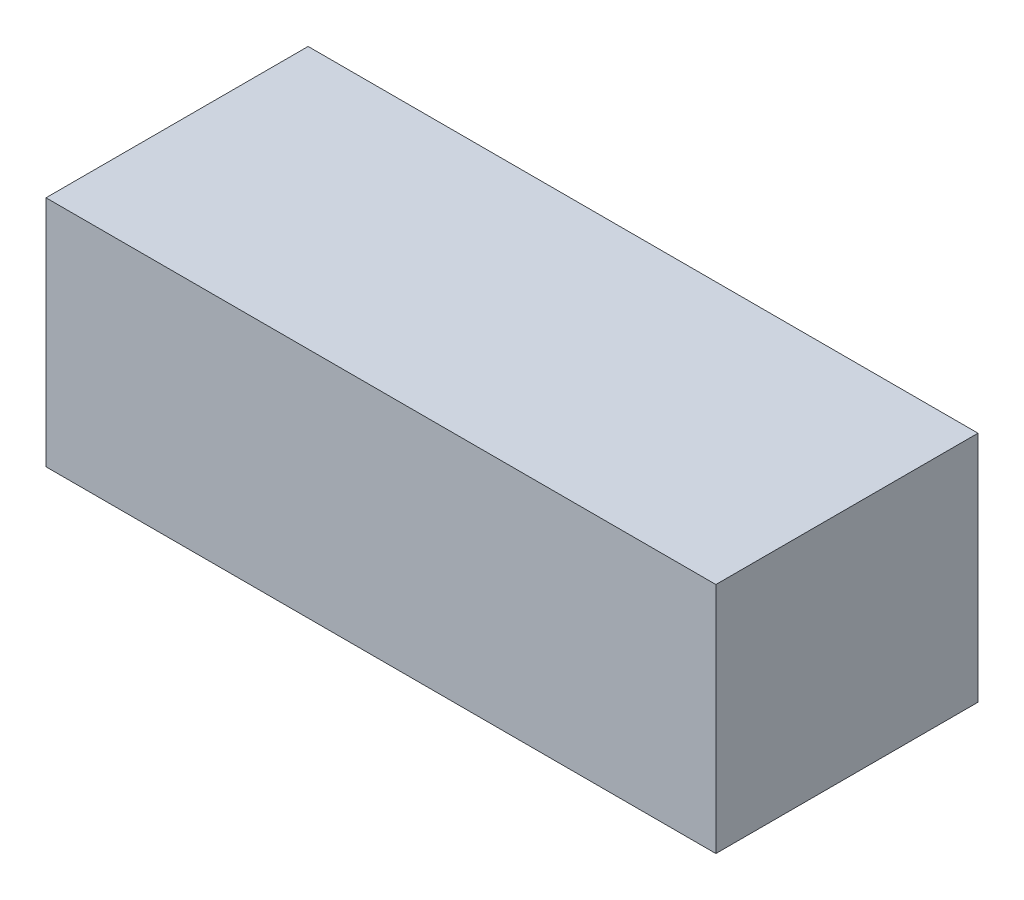
ISO-10303-21;
HEADER;
FILE_DESCRIPTION(('STEP AP214'),'2;1');
FILE_NAME('part.step','',(''),(''),'','','');
FILE_SCHEMA(('AUTOMOTIVE_DESIGN { 1 0 10303 214 1 1 1 1 }'));
ENDSEC;
DATA;
#1=APPLICATION_CONTEXT('core data for automotive mechanical design processes');
#2=APPLICATION_PROTOCOL_DEFINITION('international standard','automotive_design',2000,#1);
#3=PRODUCT_CONTEXT('',#1,'mechanical');
#4=PRODUCT('Part','Part','',(#3));
#5=PRODUCT_RELATED_PRODUCT_CATEGORY('part','',(#4));
#6=PRODUCT_DEFINITION_FORMATION('','',#4);
#7=PRODUCT_DEFINITION_CONTEXT('part definition',#1,'design');
#8=PRODUCT_DEFINITION('design','',#6,#7);
#9=PRODUCT_DEFINITION_SHAPE('','',#8);
#10=(LENGTH_UNIT() NAMED_UNIT(*) SI_UNIT(.MILLI.,.METRE.));
#11=(NAMED_UNIT(*) PLANE_ANGLE_UNIT() SI_UNIT($,.RADIAN.));
#12=(NAMED_UNIT(*) SI_UNIT($,.STERADIAN.) SOLID_ANGLE_UNIT());
#13=UNCERTAINTY_MEASURE_WITH_UNIT(LENGTH_MEASURE(1.E-05),#10,'distance_accuracy_value','');
#14=(GEOMETRIC_REPRESENTATION_CONTEXT(3) GLOBAL_UNCERTAINTY_ASSIGNED_CONTEXT((#13)) GLOBAL_UNIT_ASSIGNED_CONTEXT((#10,
#11,#12)) REPRESENTATION_CONTEXT('',''));
#15=CARTESIAN_POINT('',(0.,0.,0.));
#16=DIRECTION('',(0.,0.,1.));
#17=DIRECTION('',(1.,0.,0.));
#18=AXIS2_PLACEMENT_3D('',#15,#16,#17);
#19=CARTESIAN_POINT('',(-23.,16.,-9.));
#20=DIRECTION('',(1.,0.,0.));
#21=DIRECTION('',(0.,0.,-1.));
#22=AXIS2_PLACEMENT_3D('',#19,#20,#21);
#23=PLANE('',#22);
#24=DIRECTION('',(0.,0.,1.));
#25=VECTOR('',#24,1.);
#26=CARTESIAN_POINT('',(-23.,0.,-9.));
#27=LINE('',#26,#25);
#28=CARTESIAN_POINT('',(-23.,0.,-9.));
#29=VERTEX_POINT('',#28);
#30=CARTESIAN_POINT('',(-23.,0.,9.));
#31=VERTEX_POINT('',#30);
#32=EDGE_CURVE('E112',#29,#31,#27,.T.);
#33=ORIENTED_EDGE('',*,*,#32,.T.);
#34=DIRECTION('',(0.,-1.,0.));
#35=VECTOR('',#34,1.);
#36=CARTESIAN_POINT('',(-23.,16.,9.));
#37=LINE('',#36,#35);
#38=CARTESIAN_POINT('',(-23.,16.,9.));
#39=VERTEX_POINT('',#38);
#40=EDGE_CURVE('E11',#39,#31,#37,.T.);
#41=ORIENTED_EDGE('',*,*,#40,.F.);
#42=DIRECTION('',(0.,0.,1.));
#43=VECTOR('',#42,1.);
#44=CARTESIAN_POINT('',(-23.,16.,-9.));
#45=LINE('',#44,#43);
#46=CARTESIAN_POINT('',(-23.,16.,-9.));
#47=VERTEX_POINT('',#46);
#48=EDGE_CURVE('E96',#47,#39,#45,.T.);
#49=ORIENTED_EDGE('',*,*,#48,.F.);
#50=DIRECTION('',(0.,-1.,0.));
#51=VECTOR('',#50,1.);
#52=CARTESIAN_POINT('',(-23.,16.,-9.));
#53=LINE('',#52,#51);
#54=EDGE_CURVE('E108',#47,#29,#53,.T.);
#55=ORIENTED_EDGE('',*,*,#54,.T.);
#56=EDGE_LOOP('',(#33,#41,#49,#55));
#57=FACE_BOUND('',#56,.T.);
#58=ADVANCED_FACE('F44',(#57),#23,.F.);
#59=CARTESIAN_POINT('',(-23.,16.,9.));
#60=DIRECTION('',(0.,0.,-1.));
#61=DIRECTION('',(-1.,0.,0.));
#62=AXIS2_PLACEMENT_3D('',#59,#60,#61);
#63=PLANE('',#62);
#64=DIRECTION('',(1.,0.,0.));
#65=VECTOR('',#64,1.);
#66=CARTESIAN_POINT('',(-23.,0.,9.));
#67=LINE('',#66,#65);
#68=CARTESIAN_POINT('',(23.,0.,9.));
#69=VERTEX_POINT('',#68);
#70=EDGE_CURVE('E101',#31,#69,#67,.T.);
#71=ORIENTED_EDGE('',*,*,#70,.T.);
#72=DIRECTION('',(0.,-1.,0.));
#73=VECTOR('',#72,1.);
#74=CARTESIAN_POINT('',(23.,16.,9.));
#75=LINE('',#74,#73);
#76=CARTESIAN_POINT('',(23.,16.,9.));
#77=VERTEX_POINT('',#76);
#78=EDGE_CURVE('E53',#77,#69,#75,.T.);
#79=ORIENTED_EDGE('',*,*,#78,.F.);
#80=DIRECTION('',(1.,0.,0.));
#81=VECTOR('',#80,1.);
#82=CARTESIAN_POINT('',(-23.,16.,9.));
#83=LINE('',#82,#81);
#84=EDGE_CURVE('E91',#39,#77,#83,.T.);
#85=ORIENTED_EDGE('',*,*,#84,.F.);
#86=ORIENTED_EDGE('',*,*,#40,.T.);
#87=EDGE_LOOP('',(#71,#79,#85,#86));
#88=FACE_BOUND('',#87,.T.);
#89=ADVANCED_FACE('F100',(#88),#63,.F.);
#90=CARTESIAN_POINT('',(23.,16.,-9.));
#91=DIRECTION('',(-1.,0.,0.));
#92=DIRECTION('',(0.,0.,1.));
#93=AXIS2_PLACEMENT_3D('',#90,#91,#92);
#94=PLANE('',#93);
#95=DIRECTION('',(0.,0.,-1.));
#96=VECTOR('',#95,1.);
#97=CARTESIAN_POINT('',(23.,0.,-9.));
#98=LINE('',#97,#96);
#99=CARTESIAN_POINT('',(23.,0.,-9.));
#100=VERTEX_POINT('',#99);
#101=EDGE_CURVE('E78',#69,#100,#98,.T.);
#102=ORIENTED_EDGE('',*,*,#101,.T.);
#103=DIRECTION('',(0.,-1.,0.));
#104=VECTOR('',#103,1.);
#105=CARTESIAN_POINT('',(23.,16.,-9.));
#106=LINE('',#105,#104);
#107=CARTESIAN_POINT('',(23.,16.,-9.));
#108=VERTEX_POINT('',#107);
#109=EDGE_CURVE('E103',#108,#100,#106,.T.);
#110=ORIENTED_EDGE('',*,*,#109,.F.);
#111=DIRECTION('',(0.,0.,-1.));
#112=VECTOR('',#111,1.);
#113=CARTESIAN_POINT('',(23.,16.,-9.));
#114=LINE('',#113,#112);
#115=EDGE_CURVE('E94',#77,#108,#114,.T.);
#116=ORIENTED_EDGE('',*,*,#115,.F.);
#117=ORIENTED_EDGE('',*,*,#78,.T.);
#118=EDGE_LOOP('',(#102,#110,#116,#117));
#119=FACE_BOUND('',#118,.T.);
#120=ADVANCED_FACE('F104',(#119),#94,.F.);
#121=CARTESIAN_POINT('',(-23.,16.,-9.));
#122=DIRECTION('',(0.,0.,1.));
#123=DIRECTION('',(1.,0.,0.));
#124=AXIS2_PLACEMENT_3D('',#121,#122,#123);
#125=PLANE('',#124);
#126=DIRECTION('',(-1.,0.,0.));
#127=VECTOR('',#126,1.);
#128=CARTESIAN_POINT('',(-23.,0.,-9.));
#129=LINE('',#128,#127);
#130=EDGE_CURVE('E84',#100,#29,#129,.T.);
#131=ORIENTED_EDGE('',*,*,#130,.T.);
#132=ORIENTED_EDGE('',*,*,#54,.F.);
#133=DIRECTION('',(-1.,0.,0.));
#134=VECTOR('',#133,1.);
#135=CARTESIAN_POINT('',(-23.,16.,-9.));
#136=LINE('',#135,#134);
#137=EDGE_CURVE('E61',#108,#47,#136,.T.);
#138=ORIENTED_EDGE('',*,*,#137,.F.);
#139=ORIENTED_EDGE('',*,*,#109,.T.);
#140=EDGE_LOOP('',(#131,#132,#138,#139));
#141=FACE_BOUND('',#140,.T.);
#142=ADVANCED_FACE('F125',(#141),#125,.F.);
#143=CARTESIAN_POINT('',(0.,16.,0.));
#144=DIRECTION('',(0.,1.,0.));
#145=DIRECTION('',(0.,0.,1.));
#146=AXIS2_PLACEMENT_3D('',#143,#144,#145);
#147=PLANE('',#146);
#148=ORIENTED_EDGE('',*,*,#48,.T.);
#149=ORIENTED_EDGE('',*,*,#84,.T.);
#150=ORIENTED_EDGE('',*,*,#115,.T.);
#151=ORIENTED_EDGE('',*,*,#137,.T.);
#152=EDGE_LOOP('',(#148,#149,#150,#151));
#153=FACE_BOUND('',#152,.T.);
#154=ADVANCED_FACE('F92',(#153),#147,.T.);
#155=CARTESIAN_POINT('',(0.,0.,0.));
#156=DIRECTION('',(0.,1.,0.));
#157=DIRECTION('',(0.,0.,1.));
#158=AXIS2_PLACEMENT_3D('',#155,#156,#157);
#159=PLANE('',#158);
#160=ORIENTED_EDGE('',*,*,#32,.F.);
#161=ORIENTED_EDGE('',*,*,#130,.F.);
#162=ORIENTED_EDGE('',*,*,#101,.F.);
#163=ORIENTED_EDGE('',*,*,#70,.F.);
#164=EDGE_LOOP('',(#160,#161,#162,#163));
#165=FACE_BOUND('',#164,.T.);
#166=ADVANCED_FACE('F128',(#165),#159,.F.);
#167=CLOSED_SHELL('',(#58,#89,#120,#142,#154,#166));
#168=MANIFOLD_SOLID_BREP('B2',#167);
#169=ADVANCED_BREP_SHAPE_REPRESENTATION('',(#18,#168),#14);
#170=SHAPE_DEFINITION_REPRESENTATION(#9,#169);
ENDSEC;
END-ISO-10303-21;
